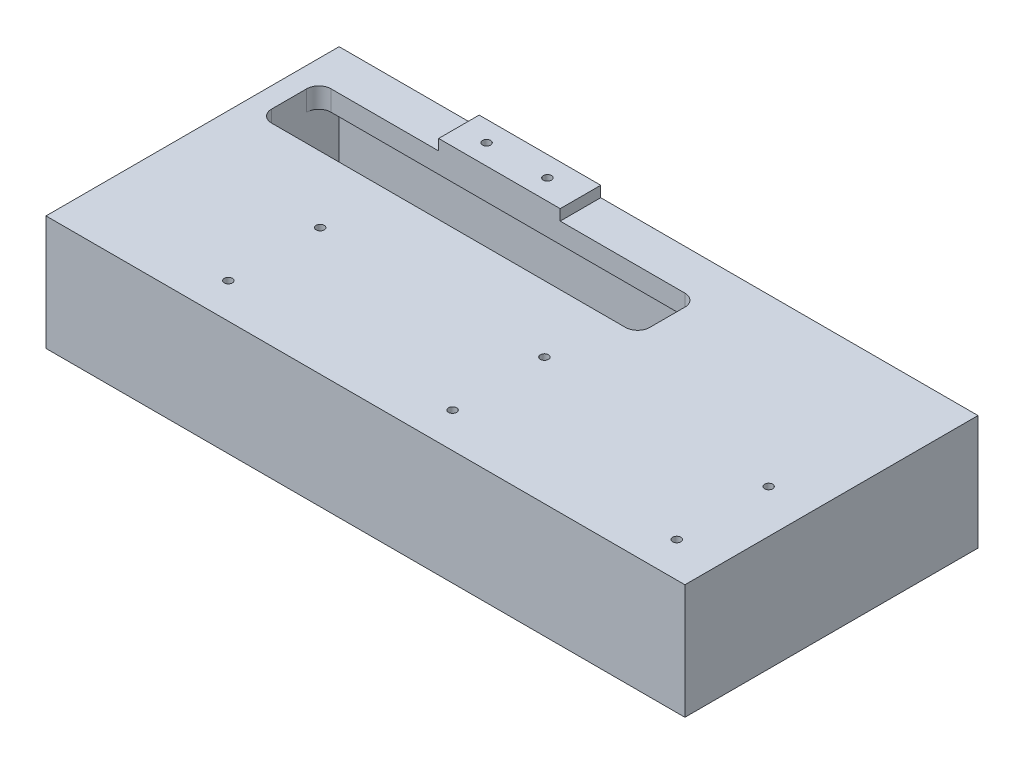
ISO-10303-21;
HEADER;
FILE_DESCRIPTION(('STEP AP214'),'2;1');
FILE_NAME('part.step','',(''),(''),'','','');
FILE_SCHEMA(('AUTOMOTIVE_DESIGN { 1 0 10303 214 1 1 1 1 }'));
ENDSEC;
DATA;
#1=APPLICATION_CONTEXT('core data for automotive mechanical design processes');
#2=APPLICATION_PROTOCOL_DEFINITION('international standard','automotive_design',2000,#1);
#3=PRODUCT_CONTEXT('',#1,'mechanical');
#4=PRODUCT('Part','Part','',(#3));
#5=PRODUCT_RELATED_PRODUCT_CATEGORY('part','',(#4));
#6=PRODUCT_DEFINITION_FORMATION('','',#4);
#7=PRODUCT_DEFINITION_CONTEXT('part definition',#1,'design');
#8=PRODUCT_DEFINITION('design','',#6,#7);
#9=PRODUCT_DEFINITION_SHAPE('','',#8);
#10=(LENGTH_UNIT() NAMED_UNIT(*) SI_UNIT(.MILLI.,.METRE.));
#11=(NAMED_UNIT(*) PLANE_ANGLE_UNIT() SI_UNIT($,.RADIAN.));
#12=(NAMED_UNIT(*) SI_UNIT($,.STERADIAN.) SOLID_ANGLE_UNIT());
#13=UNCERTAINTY_MEASURE_WITH_UNIT(LENGTH_MEASURE(1.E-05),#10,'distance_accuracy_value','');
#14=(GEOMETRIC_REPRESENTATION_CONTEXT(3) GLOBAL_UNCERTAINTY_ASSIGNED_CONTEXT((#13)) GLOBAL_UNIT_ASSIGNED_CONTEXT((#10,
#11,#12)) REPRESENTATION_CONTEXT('',''));
#15=CARTESIAN_POINT('',(0.,0.,0.));
#16=DIRECTION('',(0.,0.,1.));
#17=DIRECTION('',(1.,0.,0.));
#18=AXIS2_PLACEMENT_3D('',#15,#16,#17);
#19=CARTESIAN_POINT('',(-236.5,85.,108.5));
#20=DIRECTION('',(1.,0.,0.));
#21=DIRECTION('',(0.,0.,-1.));
#22=AXIS2_PLACEMENT_3D('',#19,#20,#21);
#23=PLANE('',#22);
#24=DIRECTION('',(0.,0.,1.));
#25=VECTOR('',#24,1.);
#26=CARTESIAN_POINT('',(-236.5,0.,108.5));
#27=LINE('',#26,#25);
#28=CARTESIAN_POINT('',(-236.5,0.,-108.5));
#29=VERTEX_POINT('',#28);
#30=CARTESIAN_POINT('',(-236.5,0.,108.5));
#31=VERTEX_POINT('',#30);
#32=EDGE_CURVE('E244',#29,#31,#27,.T.);
#33=ORIENTED_EDGE('',*,*,#32,.T.);
#34=DIRECTION('',(0.,-1.,0.));
#35=VECTOR('',#34,1.);
#36=CARTESIAN_POINT('',(-236.5,85.,108.5));
#37=LINE('',#36,#35);
#38=CARTESIAN_POINT('',(-236.5,85.,108.5));
#39=VERTEX_POINT('',#38);
#40=EDGE_CURVE('E281',#39,#31,#37,.T.);
#41=ORIENTED_EDGE('',*,*,#40,.F.);
#42=DIRECTION('',(0.,0.,1.));
#43=VECTOR('',#42,1.);
#44=CARTESIAN_POINT('',(-236.5,85.,108.5));
#45=LINE('',#44,#43);
#46=CARTESIAN_POINT('',(-236.5,85.,-108.5));
#47=VERTEX_POINT('',#46);
#48=EDGE_CURVE('E254',#47,#39,#45,.T.);
#49=ORIENTED_EDGE('',*,*,#48,.F.);
#50=DIRECTION('',(0.,-1.,0.));
#51=VECTOR('',#50,1.);
#52=CARTESIAN_POINT('',(-236.5,85.,-108.5));
#53=LINE('',#52,#51);
#54=EDGE_CURVE('E265',#47,#29,#53,.T.);
#55=ORIENTED_EDGE('',*,*,#54,.T.);
#56=EDGE_LOOP('',(#33,#41,#49,#55));
#57=FACE_BOUND('',#56,.T.);
#58=ADVANCED_FACE('F37',(#57),#23,.F.);
#59=CARTESIAN_POINT('',(236.5,85.,108.5));
#60=DIRECTION('',(0.,0.,-1.));
#61=DIRECTION('',(-1.,0.,0.));
#62=AXIS2_PLACEMENT_3D('',#59,#60,#61);
#63=PLANE('',#62);
#64=DIRECTION('',(1.,0.,0.));
#65=VECTOR('',#64,1.);
#66=CARTESIAN_POINT('',(236.5,0.,108.5));
#67=LINE('',#66,#65);
#68=CARTESIAN_POINT('',(236.5,0.,108.5));
#69=VERTEX_POINT('',#68);
#70=EDGE_CURVE('E268',#31,#69,#67,.T.);
#71=ORIENTED_EDGE('',*,*,#70,.T.);
#72=DIRECTION('',(0.,-1.,0.));
#73=VECTOR('',#72,1.);
#74=CARTESIAN_POINT('',(236.5,85.,108.5));
#75=LINE('',#74,#73);
#76=CARTESIAN_POINT('',(236.5,85.,108.5));
#77=VERTEX_POINT('',#76);
#78=EDGE_CURVE('E278',#77,#69,#75,.T.);
#79=ORIENTED_EDGE('',*,*,#78,.F.);
#80=DIRECTION('',(1.,0.,0.));
#81=VECTOR('',#80,1.);
#82=CARTESIAN_POINT('',(236.5,85.,108.5));
#83=LINE('',#82,#81);
#84=EDGE_CURVE('E257',#39,#77,#83,.T.);
#85=ORIENTED_EDGE('',*,*,#84,.F.);
#86=ORIENTED_EDGE('',*,*,#40,.T.);
#87=EDGE_LOOP('',(#71,#79,#85,#86));
#88=FACE_BOUND('',#87,.T.);
#89=ADVANCED_FACE('F423',(#88),#63,.F.);
#90=CARTESIAN_POINT('',(236.5,85.,108.5));
#91=DIRECTION('',(-1.,0.,0.));
#92=DIRECTION('',(0.,0.,1.));
#93=AXIS2_PLACEMENT_3D('',#90,#91,#92);
#94=PLANE('',#93);
#95=DIRECTION('',(0.,0.,-1.));
#96=VECTOR('',#95,1.);
#97=CARTESIAN_POINT('',(236.5,0.,108.5));
#98=LINE('',#97,#96);
#99=CARTESIAN_POINT('',(236.5,0.,-108.5));
#100=VERTEX_POINT('',#99);
#101=EDGE_CURVE('E270',#69,#100,#98,.T.);
#102=ORIENTED_EDGE('',*,*,#101,.T.);
#103=DIRECTION('',(0.,-1.,0.));
#104=VECTOR('',#103,1.);
#105=CARTESIAN_POINT('',(236.5,85.,-108.5));
#106=LINE('',#105,#104);
#107=CARTESIAN_POINT('',(236.5,85.,-108.5));
#108=VERTEX_POINT('',#107);
#109=EDGE_CURVE('E275',#108,#100,#106,.T.);
#110=ORIENTED_EDGE('',*,*,#109,.F.);
#111=DIRECTION('',(0.,0.,-1.));
#112=VECTOR('',#111,1.);
#113=CARTESIAN_POINT('',(236.5,85.,108.5));
#114=LINE('',#113,#112);
#115=EDGE_CURVE('E260',#77,#108,#114,.T.);
#116=ORIENTED_EDGE('',*,*,#115,.F.);
#117=ORIENTED_EDGE('',*,*,#78,.T.);
#118=EDGE_LOOP('',(#102,#110,#116,#117));
#119=FACE_BOUND('',#118,.T.);
#120=ADVANCED_FACE('F429',(#119),#94,.F.);
#121=CARTESIAN_POINT('',(236.5,85.,-108.5));
#122=DIRECTION('',(0.,0.,1.));
#123=DIRECTION('',(1.,0.,0.));
#124=AXIS2_PLACEMENT_3D('',#121,#122,#123);
#125=PLANE('',#124);
#126=DIRECTION('',(-1.,0.,0.));
#127=VECTOR('',#126,1.);
#128=CARTESIAN_POINT('',(236.5,0.,-108.5));
#129=LINE('',#128,#127);
#130=EDGE_CURVE('E258',#100,#29,#129,.T.);
#131=ORIENTED_EDGE('',*,*,#130,.T.);
#132=ORIENTED_EDGE('',*,*,#54,.F.);
#133=DIRECTION('',(-1.,0.,0.));
#134=VECTOR('',#133,1.);
#135=CARTESIAN_POINT('',(236.5,85.,-108.5));
#136=LINE('',#135,#134);
#137=CARTESIAN_POINT('',(-132.81,85.,-108.5));
#138=VERTEX_POINT('',#137);
#139=EDGE_CURVE('E262',#138,#47,#136,.T.);
#140=ORIENTED_EDGE('',*,*,#139,.F.);
#141=DIRECTION('',(0.,-1.,0.));
#142=VECTOR('',#141,1.);
#143=CARTESIAN_POINT('',(-132.81,93.,-108.5));
#144=LINE('',#143,#142);
#145=CARTESIAN_POINT('',(-132.81,93.,-108.5));
#146=VERTEX_POINT('',#145);
#147=EDGE_CURVE('E342',#146,#138,#144,.T.);
#148=ORIENTED_EDGE('',*,*,#147,.F.);
#149=DIRECTION('',(-1.,0.,0.));
#150=VECTOR('',#149,1.);
#151=CARTESIAN_POINT('',(-132.81,93.,-108.5));
#152=LINE('',#151,#150);
#153=CARTESIAN_POINT('',(-42.81,93.,-108.5));
#154=VERTEX_POINT('',#153);
#155=EDGE_CURVE('E189',#154,#146,#152,.T.);
#156=ORIENTED_EDGE('',*,*,#155,.F.);
#157=DIRECTION('',(0.,-1.,0.));
#158=VECTOR('',#157,1.);
#159=CARTESIAN_POINT('',(-42.81,93.,-108.5));
#160=LINE('',#159,#158);
#161=CARTESIAN_POINT('',(-42.81,85.,-108.5));
#162=VERTEX_POINT('',#161);
#163=EDGE_CURVE('E200',#154,#162,#160,.T.);
#164=ORIENTED_EDGE('',*,*,#163,.T.);
#165=EDGE_CURVE('E263',#108,#162,#136,.T.);
#166=ORIENTED_EDGE('',*,*,#165,.F.);
#167=ORIENTED_EDGE('',*,*,#109,.T.);
#168=EDGE_LOOP('',(#131,#132,#140,#148,#156,#164,#166,#167));
#169=FACE_BOUND('',#168,.T.);
#170=ADVANCED_FACE('F344',(#169),#125,.F.);
#171=CARTESIAN_POINT('',(0.,85.,0.));
#172=DIRECTION('',(0.,1.,0.));
#173=DIRECTION('',(0.,0.,1.));
#174=AXIS2_PLACEMENT_3D('',#171,#172,#173);
#175=PLANE('',#174);
#176=CARTESIAN_POINT('',(-127.5,85.,14.5));
#177=DIRECTION('',(0.,1.,0.));
#178=DIRECTION('',(0.,0.,1.));
#179=AXIS2_PLACEMENT_3D('',#176,#177,#178);
#180=CIRCLE('',#179,2.99999999999999);
#181=CARTESIAN_POINT('',(-127.5,85.,17.5));
#182=VERTEX_POINT('',#181);
#183=EDGE_CURVE('E363',#182,#182,#180,.T.);
#184=ORIENTED_EDGE('',*,*,#183,.F.);
#185=EDGE_LOOP('',(#184));
#186=FACE_BOUND('',#185,.T.);
#187=CARTESIAN_POINT('',(38.5,85.,14.5));
#188=DIRECTION('',(0.,1.,0.));
#189=DIRECTION('',(0.,0.,1.));
#190=AXIS2_PLACEMENT_3D('',#187,#188,#189);
#191=CIRCLE('',#190,3.00000000000001);
#192=CARTESIAN_POINT('',(38.5,85.,17.5));
#193=VERTEX_POINT('',#192);
#194=EDGE_CURVE('E382',#193,#193,#191,.T.);
#195=ORIENTED_EDGE('',*,*,#194,.F.);
#196=EDGE_LOOP('',(#195));
#197=FACE_BOUND('',#196,.T.);
#198=CARTESIAN_POINT('',(204.5,85.,14.5));
#199=DIRECTION('',(0.,1.,0.));
#200=DIRECTION('',(0.,0.,1.));
#201=AXIS2_PLACEMENT_3D('',#198,#199,#200);
#202=CIRCLE('',#201,2.99999999999999);
#203=CARTESIAN_POINT('',(204.5,85.,17.5));
#204=VERTEX_POINT('',#203);
#205=EDGE_CURVE('E376',#204,#204,#202,.T.);
#206=ORIENTED_EDGE('',*,*,#205,.F.);
#207=EDGE_LOOP('',(#206));
#208=FACE_BOUND('',#207,.T.);
#209=CARTESIAN_POINT('',(204.5,85.,82.5));
#210=DIRECTION('',(0.,1.,0.));
#211=DIRECTION('',(0.,0.,1.));
#212=AXIS2_PLACEMENT_3D('',#209,#210,#211);
#213=CIRCLE('',#212,2.99999999999999);
#214=CARTESIAN_POINT('',(204.5,85.,85.5));
#215=VERTEX_POINT('',#214);
#216=EDGE_CURVE('E369',#215,#215,#213,.T.);
#217=ORIENTED_EDGE('',*,*,#216,.F.);
#218=EDGE_LOOP('',(#217));
#219=FACE_BOUND('',#218,.T.);
#220=CARTESIAN_POINT('',(38.5,85.,82.5));
#221=DIRECTION('',(0.,1.,0.));
#222=DIRECTION('',(0.,0.,1.));
#223=AXIS2_PLACEMENT_3D('',#220,#221,#222);
#224=CIRCLE('',#223,3.00000000000001);
#225=CARTESIAN_POINT('',(38.5,85.,85.5));
#226=VERTEX_POINT('',#225);
#227=EDGE_CURVE('E370',#226,#226,#224,.T.);
#228=ORIENTED_EDGE('',*,*,#227,.F.);
#229=EDGE_LOOP('',(#228));
#230=FACE_BOUND('',#229,.T.);
#231=CARTESIAN_POINT('',(-127.5,85.,82.5));
#232=DIRECTION('',(0.,1.,0.));
#233=DIRECTION('',(0.,0.,1.));
#234=AXIS2_PLACEMENT_3D('',#231,#232,#233);
#235=CIRCLE('',#234,2.99999999999999);
#236=CARTESIAN_POINT('',(-127.5,85.,85.5));
#237=VERTEX_POINT('',#236);
#238=EDGE_CURVE('E360',#237,#237,#235,.T.);
#239=ORIENTED_EDGE('',*,*,#238,.F.);
#240=EDGE_LOOP('',(#239));
#241=FACE_BOUND('',#240,.T.);
#242=DIRECTION('',(0.,0.,1.));
#243=VECTOR('',#242,1.);
#244=CARTESIAN_POINT('',(-132.81,85.,-108.5));
#245=LINE('',#244,#243);
#246=CARTESIAN_POINT('',(-132.81,85.,-78.5));
#247=VERTEX_POINT('',#246);
#248=EDGE_CURVE('E52',#138,#247,#245,.T.);
#249=ORIENTED_EDGE('',*,*,#248,.F.);
#250=ORIENTED_EDGE('',*,*,#139,.T.);
#251=ORIENTED_EDGE('',*,*,#48,.T.);
#252=ORIENTED_EDGE('',*,*,#84,.T.);
#253=ORIENTED_EDGE('',*,*,#115,.T.);
#254=ORIENTED_EDGE('',*,*,#165,.T.);
#255=DIRECTION('',(0.,0.,-1.));
#256=VECTOR('',#255,1.);
#257=CARTESIAN_POINT('',(-42.81,85.,-108.5));
#258=LINE('',#257,#256);
#259=CARTESIAN_POINT('',(-42.81,85.,-78.4999999999999));
#260=VERTEX_POINT('',#259);
#261=EDGE_CURVE('E193',#260,#162,#258,.T.);
#262=ORIENTED_EDGE('',*,*,#261,.F.);
#263=DIRECTION('',(-1.,0.,0.));
#264=VECTOR('',#263,1.);
#265=CARTESIAN_POINT('',(-221.5,85.,-78.5));
#266=LINE('',#265,#264);
#267=CARTESIAN_POINT('',(49.5,85.,-78.4999999999999));
#268=VERTEX_POINT('',#267);
#269=EDGE_CURVE('E238',#268,#260,#266,.T.);
#270=ORIENTED_EDGE('',*,*,#269,.F.);
#271=CARTESIAN_POINT('',(49.5,85.,-69.5));
#272=DIRECTION('',(0.,1.,0.));
#273=DIRECTION('',(0.,0.,1.));
#274=AXIS2_PLACEMENT_3D('',#271,#272,#273);
#275=CIRCLE('',#274,9.);
#276=CARTESIAN_POINT('',(58.5,85.,-69.5));
#277=VERTEX_POINT('',#276);
#278=EDGE_CURVE('E313',#268,#277,#275,.F.);
#279=ORIENTED_EDGE('',*,*,#278,.T.);
#280=DIRECTION('',(0.,0.,-1.));
#281=VECTOR('',#280,1.);
#282=CARTESIAN_POINT('',(58.5,85.,-78.4999999999999));
#283=LINE('',#282,#281);
#284=CARTESIAN_POINT('',(58.5,85.,-43.5));
#285=VERTEX_POINT('',#284);
#286=EDGE_CURVE('E250',#285,#277,#283,.T.);
#287=ORIENTED_EDGE('',*,*,#286,.F.);
#288=CARTESIAN_POINT('',(49.5,85.,-43.5));
#289=DIRECTION('',(0.,1.,0.));
#290=DIRECTION('',(0.,0.,1.));
#291=AXIS2_PLACEMENT_3D('',#288,#289,#290);
#292=CIRCLE('',#291,9.);
#293=CARTESIAN_POINT('',(49.5,85.,-34.5));
#294=VERTEX_POINT('',#293);
#295=EDGE_CURVE('E309',#285,#294,#292,.F.);
#296=ORIENTED_EDGE('',*,*,#295,.T.);
#297=DIRECTION('',(1.,0.,0.));
#298=VECTOR('',#297,1.);
#299=CARTESIAN_POINT('',(-221.5,85.,-34.5));
#300=LINE('',#299,#298);
#301=CARTESIAN_POINT('',(-212.5,85.,-34.5));
#302=VERTEX_POINT('',#301);
#303=EDGE_CURVE('E247',#302,#294,#300,.T.);
#304=ORIENTED_EDGE('',*,*,#303,.F.);
#305=CARTESIAN_POINT('',(-212.5,85.,-43.5));
#306=DIRECTION('',(0.,1.,0.));
#307=DIRECTION('',(0.,0.,1.));
#308=AXIS2_PLACEMENT_3D('',#305,#306,#307);
#309=CIRCLE('',#308,9.);
#310=CARTESIAN_POINT('',(-221.5,85.,-43.5));
#311=VERTEX_POINT('',#310);
#312=EDGE_CURVE('E305',#302,#311,#309,.F.);
#313=ORIENTED_EDGE('',*,*,#312,.T.);
#314=DIRECTION('',(0.,0.,1.));
#315=VECTOR('',#314,1.);
#316=CARTESIAN_POINT('',(-221.5,85.,-78.5));
#317=LINE('',#316,#315);
#318=CARTESIAN_POINT('',(-221.5,85.,-69.5));
#319=VERTEX_POINT('',#318);
#320=EDGE_CURVE('E227',#319,#311,#317,.T.);
#321=ORIENTED_EDGE('',*,*,#320,.F.);
#322=CARTESIAN_POINT('',(-212.5,85.,-69.5));
#323=DIRECTION('',(0.,1.,0.));
#324=DIRECTION('',(0.,0.,1.));
#325=AXIS2_PLACEMENT_3D('',#322,#323,#324);
#326=CIRCLE('',#325,9.);
#327=CARTESIAN_POINT('',(-212.5,85.,-78.5));
#328=VERTEX_POINT('',#327);
#329=EDGE_CURVE('E45',#319,#328,#326,.F.);
#330=ORIENTED_EDGE('',*,*,#329,.T.);
#331=EDGE_CURVE('E57',#247,#328,#266,.T.);
#332=ORIENTED_EDGE('',*,*,#331,.F.);
#333=EDGE_LOOP('',(#249,#250,#251,#252,#253,#254,#262,#270,#279,#287,#296,#304,#313,#321,#330,#332));
#334=FACE_BOUND('',#333,.T.);
#335=ADVANCED_FACE('F318',(#186,#197,#208,#219,#230,#241,#334),#175,.T.);
#336=CARTESIAN_POINT('',(0.,0.,0.));
#337=DIRECTION('',(0.,1.,0.));
#338=DIRECTION('',(0.,0.,1.));
#339=AXIS2_PLACEMENT_3D('',#336,#337,#338);
#340=PLANE('',#339);
#341=DIRECTION('',(0.,0.,-1.));
#342=VECTOR('',#341,1.);
#343=CARTESIAN_POINT('',(-221.5,0.,93.5));
#344=LINE('',#343,#342);
#345=CARTESIAN_POINT('',(-221.5,0.,93.5));
#346=VERTEX_POINT('',#345);
#347=CARTESIAN_POINT('',(-221.5,0.,-93.5));
#348=VERTEX_POINT('',#347);
#349=EDGE_CURVE('E198',#346,#348,#344,.T.);
#350=ORIENTED_EDGE('',*,*,#349,.F.);
#351=DIRECTION('',(-1.,0.,0.));
#352=VECTOR('',#351,1.);
#353=CARTESIAN_POINT('',(221.5,0.,93.5));
#354=LINE('',#353,#352);
#355=CARTESIAN_POINT('',(221.5,0.,93.5));
#356=VERTEX_POINT('',#355);
#357=EDGE_CURVE('E196',#356,#346,#354,.T.);
#358=ORIENTED_EDGE('',*,*,#357,.F.);
#359=DIRECTION('',(0.,0.,1.));
#360=VECTOR('',#359,1.);
#361=CARTESIAN_POINT('',(221.5,0.,-93.5));
#362=LINE('',#361,#360);
#363=CARTESIAN_POINT('',(221.5,0.,-93.5));
#364=VERTEX_POINT('',#363);
#365=EDGE_CURVE('E208',#364,#356,#362,.T.);
#366=ORIENTED_EDGE('',*,*,#365,.F.);
#367=DIRECTION('',(1.,0.,0.));
#368=VECTOR('',#367,1.);
#369=CARTESIAN_POINT('',(-221.5,0.,-93.5));
#370=LINE('',#369,#368);
#371=EDGE_CURVE('E220',#348,#364,#370,.T.);
#372=ORIENTED_EDGE('',*,*,#371,.F.);
#373=EDGE_LOOP('',(#350,#358,#366,#372));
#374=FACE_BOUND('',#373,.T.);
#375=ORIENTED_EDGE('',*,*,#32,.F.);
#376=ORIENTED_EDGE('',*,*,#130,.F.);
#377=ORIENTED_EDGE('',*,*,#101,.F.);
#378=ORIENTED_EDGE('',*,*,#70,.F.);
#379=EDGE_LOOP('',(#375,#376,#377,#378));
#380=FACE_BOUND('',#379,.T.);
#381=ADVANCED_FACE('F400',(#374,#380),#340,.F.);
#382=CARTESIAN_POINT('',(-221.5,70.,-78.5));
#383=DIRECTION('',(-1.,0.,0.));
#384=DIRECTION('',(0.,0.,1.));
#385=AXIS2_PLACEMENT_3D('',#382,#383,#384);
#386=PLANE('',#385);
#387=ORIENTED_EDGE('',*,*,#320,.T.);
#388=DIRECTION('',(0.,1.,0.));
#389=VECTOR('',#388,1.);
#390=CARTESIAN_POINT('',(-221.5,70.,-43.5));
#391=LINE('',#390,#389);
#392=CARTESIAN_POINT('',(-221.5,70.,-43.5));
#393=VERTEX_POINT('',#392);
#394=EDGE_CURVE('E292',#311,#393,#391,.F.);
#395=ORIENTED_EDGE('',*,*,#394,.T.);
#396=DIRECTION('',(0.,0.,-1.));
#397=VECTOR('',#396,1.);
#398=CARTESIAN_POINT('',(-221.5,70.,93.5));
#399=LINE('',#398,#397);
#400=CARTESIAN_POINT('',(-221.5,70.,93.5));
#401=VERTEX_POINT('',#400);
#402=EDGE_CURVE('E209',#401,#393,#399,.T.);
#403=ORIENTED_EDGE('',*,*,#402,.F.);
#404=DIRECTION('',(0.,-1.,0.));
#405=VECTOR('',#404,1.);
#406=CARTESIAN_POINT('',(-221.5,70.,93.5));
#407=LINE('',#406,#405);
#408=EDGE_CURVE('E216',#401,#346,#407,.T.);
#409=ORIENTED_EDGE('',*,*,#408,.T.);
#410=ORIENTED_EDGE('',*,*,#349,.T.);
#411=DIRECTION('',(0.,-1.,0.));
#412=VECTOR('',#411,1.);
#413=CARTESIAN_POINT('',(-221.5,70.,-93.5));
#414=LINE('',#413,#412);
#415=CARTESIAN_POINT('',(-221.5,70.,-93.5));
#416=VERTEX_POINT('',#415);
#417=EDGE_CURVE('E230',#416,#348,#414,.T.);
#418=ORIENTED_EDGE('',*,*,#417,.F.);
#419=CARTESIAN_POINT('',(-221.5,70.,-69.5));
#420=VERTEX_POINT('',#419);
#421=EDGE_CURVE('E207',#420,#416,#399,.T.);
#422=ORIENTED_EDGE('',*,*,#421,.F.);
#423=DIRECTION('',(0.,1.,0.));
#424=VECTOR('',#423,1.);
#425=CARTESIAN_POINT('',(-221.5,85.,-69.5));
#426=LINE('',#425,#424);
#427=EDGE_CURVE('E289',#420,#319,#426,.T.);
#428=ORIENTED_EDGE('',*,*,#427,.T.);
#429=EDGE_LOOP('',(#387,#395,#403,#409,#410,#418,#422,#428));
#430=FACE_BOUND('',#429,.T.);
#431=ADVANCED_FACE('F474',(#430),#386,.F.);
#432=CARTESIAN_POINT('',(-221.5,70.,-78.5));
#433=DIRECTION('',(0.,0.,-1.));
#434=DIRECTION('',(-1.,0.,0.));
#435=AXIS2_PLACEMENT_3D('',#432,#433,#434);
#436=PLANE('',#435);
#437=DIRECTION('',(-1.,0.,0.));
#438=VECTOR('',#437,1.);
#439=CARTESIAN_POINT('',(-221.5,70.,-78.5));
#440=LINE('',#439,#438);
#441=CARTESIAN_POINT('',(49.5,70.,-78.4999999999999));
#442=VERTEX_POINT('',#441);
#443=CARTESIAN_POINT('',(-212.5,70.,-78.5));
#444=VERTEX_POINT('',#443);
#445=EDGE_CURVE('E241',#442,#444,#440,.T.);
#446=ORIENTED_EDGE('',*,*,#445,.F.);
#447=DIRECTION('',(0.,1.,0.));
#448=VECTOR('',#447,1.);
#449=CARTESIAN_POINT('',(49.5,85.,-78.4999999999999));
#450=LINE('',#449,#448);
#451=EDGE_CURVE('E302',#442,#268,#450,.T.);
#452=ORIENTED_EDGE('',*,*,#451,.T.);
#453=ORIENTED_EDGE('',*,*,#269,.T.);
#454=DIRECTION('',(0.,-1.,0.));
#455=VECTOR('',#454,1.);
#456=CARTESIAN_POINT('',(-42.81,93.,-78.4999999999999));
#457=LINE('',#456,#455);
#458=CARTESIAN_POINT('',(-42.81,93.,-78.4999999999999));
#459=VERTEX_POINT('',#458);
#460=EDGE_CURVE('E180',#459,#260,#457,.T.);
#461=ORIENTED_EDGE('',*,*,#460,.F.);
#462=DIRECTION('',(1.,0.,0.));
#463=VECTOR('',#462,1.);
#464=CARTESIAN_POINT('',(-132.81,93.,-78.4999999999999));
#465=LINE('',#464,#463);
#466=CARTESIAN_POINT('',(-132.81,93.,-78.4999999999999));
#467=VERTEX_POINT('',#466);
#468=EDGE_CURVE('E172',#467,#459,#465,.T.);
#469=ORIENTED_EDGE('',*,*,#468,.F.);
#470=DIRECTION('',(0.,-1.,0.));
#471=VECTOR('',#470,1.);
#472=CARTESIAN_POINT('',(-132.81,93.,-78.4999999999999));
#473=LINE('',#472,#471);
#474=EDGE_CURVE('E177',#467,#247,#473,.T.);
#475=ORIENTED_EDGE('',*,*,#474,.T.);
#476=ORIENTED_EDGE('',*,*,#331,.T.);
#477=DIRECTION('',(0.,1.,0.));
#478=VECTOR('',#477,1.);
#479=CARTESIAN_POINT('',(-212.5,70.,-78.5));
#480=LINE('',#479,#478);
#481=EDGE_CURVE('E300',#328,#444,#480,.F.);
#482=ORIENTED_EDGE('',*,*,#481,.T.);
#483=EDGE_LOOP('',(#446,#452,#453,#461,#469,#475,#476,#482));
#484=FACE_BOUND('',#483,.T.);
#485=ADVANCED_FACE('F175',(#484),#436,.F.);
#486=CARTESIAN_POINT('',(58.5,70.,-78.4999999999999));
#487=DIRECTION('',(1.,0.,0.));
#488=DIRECTION('',(0.,0.,-1.));
#489=AXIS2_PLACEMENT_3D('',#486,#487,#488);
#490=PLANE('',#489);
#491=DIRECTION('',(0.,0.,-1.));
#492=VECTOR('',#491,1.);
#493=CARTESIAN_POINT('',(58.5,70.,-78.4999999999999));
#494=LINE('',#493,#492);
#495=CARTESIAN_POINT('',(58.5,70.,-43.5));
#496=VERTEX_POINT('',#495);
#497=CARTESIAN_POINT('',(58.5,70.,-69.5));
#498=VERTEX_POINT('',#497);
#499=EDGE_CURVE('E237',#496,#498,#494,.T.);
#500=ORIENTED_EDGE('',*,*,#499,.F.);
#501=DIRECTION('',(0.,1.,0.));
#502=VECTOR('',#501,1.);
#503=CARTESIAN_POINT('',(58.5,85.,-43.5));
#504=LINE('',#503,#502);
#505=EDGE_CURVE('E297',#496,#285,#504,.T.);
#506=ORIENTED_EDGE('',*,*,#505,.T.);
#507=ORIENTED_EDGE('',*,*,#286,.T.);
#508=DIRECTION('',(0.,1.,0.));
#509=VECTOR('',#508,1.);
#510=CARTESIAN_POINT('',(58.5,70.,-69.5));
#511=LINE('',#510,#509);
#512=EDGE_CURVE('E295',#277,#498,#511,.F.);
#513=ORIENTED_EDGE('',*,*,#512,.T.);
#514=EDGE_LOOP('',(#500,#506,#507,#513));
#515=FACE_BOUND('',#514,.T.);
#516=ADVANCED_FACE('F473',(#515),#490,.F.);
#517=CARTESIAN_POINT('',(-221.5,70.,-34.5));
#518=DIRECTION('',(0.,0.,1.));
#519=DIRECTION('',(1.,0.,0.));
#520=AXIS2_PLACEMENT_3D('',#517,#518,#519);
#521=PLANE('',#520);
#522=DIRECTION('',(1.,0.,0.));
#523=VECTOR('',#522,1.);
#524=CARTESIAN_POINT('',(-221.5,70.,-34.5));
#525=LINE('',#524,#523);
#526=CARTESIAN_POINT('',(-212.5,70.,-34.5));
#527=VERTEX_POINT('',#526);
#528=CARTESIAN_POINT('',(49.5,70.,-34.5));
#529=VERTEX_POINT('',#528);
#530=EDGE_CURVE('E234',#527,#529,#525,.T.);
#531=ORIENTED_EDGE('',*,*,#530,.F.);
#532=DIRECTION('',(0.,1.,0.));
#533=VECTOR('',#532,1.);
#534=CARTESIAN_POINT('',(-212.5,85.,-34.5));
#535=LINE('',#534,#533);
#536=EDGE_CURVE('E286',#527,#302,#535,.T.);
#537=ORIENTED_EDGE('',*,*,#536,.T.);
#538=ORIENTED_EDGE('',*,*,#303,.T.);
#539=DIRECTION('',(0.,1.,0.));
#540=VECTOR('',#539,1.);
#541=CARTESIAN_POINT('',(49.5,70.,-34.5));
#542=LINE('',#541,#540);
#543=EDGE_CURVE('E284',#294,#529,#542,.F.);
#544=ORIENTED_EDGE('',*,*,#543,.T.);
#545=EDGE_LOOP('',(#531,#537,#538,#544));
#546=FACE_BOUND('',#545,.T.);
#547=ADVANCED_FACE('F459',(#546),#521,.F.);
#548=CARTESIAN_POINT('',(0.,70.,0.));
#549=DIRECTION('',(0.,-1.,0.));
#550=DIRECTION('',(0.,0.,-1.));
#551=AXIS2_PLACEMENT_3D('',#548,#549,#550);
#552=PLANE('',#551);
#553=CARTESIAN_POINT('',(-127.5,70.,14.5));
#554=DIRECTION('',(0.,1.,0.));
#555=DIRECTION('',(0.,0.,1.));
#556=AXIS2_PLACEMENT_3D('',#553,#554,#555);
#557=CIRCLE('',#556,2.99999999999999);
#558=CARTESIAN_POINT('',(-127.5,70.,17.5));
#559=VERTEX_POINT('',#558);
#560=EDGE_CURVE('E385',#559,#559,#557,.T.);
#561=ORIENTED_EDGE('',*,*,#560,.T.);
#562=EDGE_LOOP('',(#561));
#563=FACE_BOUND('',#562,.T.);
#564=CARTESIAN_POINT('',(38.5,70.,14.5));
#565=DIRECTION('',(0.,1.,0.));
#566=DIRECTION('',(0.,0.,1.));
#567=AXIS2_PLACEMENT_3D('',#564,#565,#566);
#568=CIRCLE('',#567,3.00000000000001);
#569=CARTESIAN_POINT('',(38.5,70.,17.5));
#570=VERTEX_POINT('',#569);
#571=EDGE_CURVE('E379',#570,#570,#568,.T.);
#572=ORIENTED_EDGE('',*,*,#571,.T.);
#573=EDGE_LOOP('',(#572));
#574=FACE_BOUND('',#573,.T.);
#575=CARTESIAN_POINT('',(204.5,70.,14.5));
#576=DIRECTION('',(0.,1.,0.));
#577=DIRECTION('',(0.,0.,1.));
#578=AXIS2_PLACEMENT_3D('',#575,#576,#577);
#579=CIRCLE('',#578,2.99999999999999);
#580=CARTESIAN_POINT('',(204.5,70.,17.5));
#581=VERTEX_POINT('',#580);
#582=EDGE_CURVE('E373',#581,#581,#579,.T.);
#583=ORIENTED_EDGE('',*,*,#582,.T.);
#584=EDGE_LOOP('',(#583));
#585=FACE_BOUND('',#584,.T.);
#586=CARTESIAN_POINT('',(204.5,70.,82.5));
#587=DIRECTION('',(0.,1.,0.));
#588=DIRECTION('',(0.,0.,1.));
#589=AXIS2_PLACEMENT_3D('',#586,#587,#588);
#590=CIRCLE('',#589,2.99999999999999);
#591=CARTESIAN_POINT('',(204.5,70.,85.5));
#592=VERTEX_POINT('',#591);
#593=EDGE_CURVE('E366',#592,#592,#590,.T.);
#594=ORIENTED_EDGE('',*,*,#593,.T.);
#595=EDGE_LOOP('',(#594));
#596=FACE_BOUND('',#595,.T.);
#597=CARTESIAN_POINT('',(38.5,70.,82.5));
#598=DIRECTION('',(0.,1.,0.));
#599=DIRECTION('',(0.,0.,1.));
#600=AXIS2_PLACEMENT_3D('',#597,#598,#599);
#601=CIRCLE('',#600,3.00000000000001);
#602=CARTESIAN_POINT('',(38.5,70.,85.5));
#603=VERTEX_POINT('',#602);
#604=EDGE_CURVE('E390',#603,#603,#601,.T.);
#605=ORIENTED_EDGE('',*,*,#604,.T.);
#606=EDGE_LOOP('',(#605));
#607=FACE_BOUND('',#606,.T.);
#608=CARTESIAN_POINT('',(-127.5,70.,82.5));
#609=DIRECTION('',(0.,1.,0.));
#610=DIRECTION('',(0.,0.,1.));
#611=AXIS2_PLACEMENT_3D('',#608,#609,#610);
#612=CIRCLE('',#611,2.99999999999999);
#613=CARTESIAN_POINT('',(-127.5,70.,85.5));
#614=VERTEX_POINT('',#613);
#615=EDGE_CURVE('E352',#614,#614,#612,.T.);
#616=ORIENTED_EDGE('',*,*,#615,.T.);
#617=EDGE_LOOP('',(#616));
#618=FACE_BOUND('',#617,.T.);
#619=ORIENTED_EDGE('',*,*,#402,.T.);
#620=CARTESIAN_POINT('',(-212.5,70.,-43.5));
#621=DIRECTION('',(0.,-1.,0.));
#622=DIRECTION('',(0.,0.,-1.));
#623=AXIS2_PLACEMENT_3D('',#620,#621,#622);
#624=CIRCLE('',#623,9.);
#625=EDGE_CURVE('E307',#393,#527,#624,.F.);
#626=ORIENTED_EDGE('',*,*,#625,.T.);
#627=ORIENTED_EDGE('',*,*,#530,.T.);
#628=CARTESIAN_POINT('',(49.5,70.,-43.5));
#629=DIRECTION('',(0.,-1.,0.));
#630=DIRECTION('',(0.,0.,-1.));
#631=AXIS2_PLACEMENT_3D('',#628,#629,#630);
#632=CIRCLE('',#631,9.);
#633=EDGE_CURVE('E311',#529,#496,#632,.F.);
#634=ORIENTED_EDGE('',*,*,#633,.T.);
#635=ORIENTED_EDGE('',*,*,#499,.T.);
#636=CARTESIAN_POINT('',(49.5,70.,-69.5));
#637=DIRECTION('',(0.,-1.,0.));
#638=DIRECTION('',(0.,0.,-1.));
#639=AXIS2_PLACEMENT_3D('',#636,#637,#638);
#640=CIRCLE('',#639,9.);
#641=EDGE_CURVE('E315',#498,#442,#640,.F.);
#642=ORIENTED_EDGE('',*,*,#641,.T.);
#643=ORIENTED_EDGE('',*,*,#445,.T.);
#644=CARTESIAN_POINT('',(-212.5,70.,-69.5));
#645=DIRECTION('',(0.,-1.,0.));
#646=DIRECTION('',(0.,0.,-1.));
#647=AXIS2_PLACEMENT_3D('',#644,#645,#646);
#648=CIRCLE('',#647,9.);
#649=EDGE_CURVE('E11',#444,#420,#648,.F.);
#650=ORIENTED_EDGE('',*,*,#649,.T.);
#651=ORIENTED_EDGE('',*,*,#421,.T.);
#652=DIRECTION('',(1.,0.,0.));
#653=VECTOR('',#652,1.);
#654=CARTESIAN_POINT('',(-221.5,70.,-93.5));
#655=LINE('',#654,#653);
#656=CARTESIAN_POINT('',(221.5,70.,-93.5));
#657=VERTEX_POINT('',#656);
#658=EDGE_CURVE('E211',#416,#657,#655,.T.);
#659=ORIENTED_EDGE('',*,*,#658,.T.);
#660=DIRECTION('',(0.,0.,1.));
#661=VECTOR('',#660,1.);
#662=CARTESIAN_POINT('',(221.5,70.,-93.5));
#663=LINE('',#662,#661);
#664=CARTESIAN_POINT('',(221.5,70.,93.5));
#665=VERTEX_POINT('',#664);
#666=EDGE_CURVE('E214',#657,#665,#663,.T.);
#667=ORIENTED_EDGE('',*,*,#666,.T.);
#668=DIRECTION('',(-1.,0.,0.));
#669=VECTOR('',#668,1.);
#670=CARTESIAN_POINT('',(221.5,70.,93.5));
#671=LINE('',#670,#669);
#672=EDGE_CURVE('E204',#665,#401,#671,.T.);
#673=ORIENTED_EDGE('',*,*,#672,.T.);
#674=EDGE_LOOP('',(#619,#626,#627,#634,#635,#642,#643,#650,#651,#659,#667,#673));
#675=FACE_BOUND('',#674,.T.);
#676=ADVANCED_FACE('F324',(#563,#574,#585,#596,#607,#618,#675),#552,.T.);
#677=CARTESIAN_POINT('',(221.5,70.,93.5));
#678=DIRECTION('',(0.,0.,1.));
#679=DIRECTION('',(1.,0.,0.));
#680=AXIS2_PLACEMENT_3D('',#677,#678,#679);
#681=PLANE('',#680);
#682=ORIENTED_EDGE('',*,*,#357,.T.);
#683=ORIENTED_EDGE('',*,*,#408,.F.);
#684=ORIENTED_EDGE('',*,*,#672,.F.);
#685=DIRECTION('',(0.,-1.,0.));
#686=VECTOR('',#685,1.);
#687=CARTESIAN_POINT('',(221.5,70.,93.5));
#688=LINE('',#687,#686);
#689=EDGE_CURVE('E225',#665,#356,#688,.T.);
#690=ORIENTED_EDGE('',*,*,#689,.T.);
#691=EDGE_LOOP('',(#682,#683,#684,#690));
#692=FACE_BOUND('',#691,.T.);
#693=ADVANCED_FACE('F458',(#692),#681,.F.);
#694=CARTESIAN_POINT('',(221.5,70.,-93.5));
#695=DIRECTION('',(1.,0.,0.));
#696=DIRECTION('',(0.,0.,-1.));
#697=AXIS2_PLACEMENT_3D('',#694,#695,#696);
#698=PLANE('',#697);
#699=ORIENTED_EDGE('',*,*,#365,.T.);
#700=ORIENTED_EDGE('',*,*,#689,.F.);
#701=ORIENTED_EDGE('',*,*,#666,.F.);
#702=DIRECTION('',(0.,-1.,0.));
#703=VECTOR('',#702,1.);
#704=CARTESIAN_POINT('',(221.5,70.,-93.5));
#705=LINE('',#704,#703);
#706=EDGE_CURVE('E228',#657,#364,#705,.T.);
#707=ORIENTED_EDGE('',*,*,#706,.T.);
#708=EDGE_LOOP('',(#699,#700,#701,#707));
#709=FACE_BOUND('',#708,.T.);
#710=ADVANCED_FACE('F461',(#709),#698,.F.);
#711=CARTESIAN_POINT('',(-221.5,70.,-93.5));
#712=DIRECTION('',(0.,0.,-1.));
#713=DIRECTION('',(-1.,0.,0.));
#714=AXIS2_PLACEMENT_3D('',#711,#712,#713);
#715=PLANE('',#714);
#716=ORIENTED_EDGE('',*,*,#371,.T.);
#717=ORIENTED_EDGE('',*,*,#706,.F.);
#718=ORIENTED_EDGE('',*,*,#658,.F.);
#719=ORIENTED_EDGE('',*,*,#417,.T.);
#720=EDGE_LOOP('',(#716,#717,#718,#719));
#721=FACE_BOUND('',#720,.T.);
#722=ADVANCED_FACE('F438',(#721),#715,.F.);
#723=CARTESIAN_POINT('',(-212.5,70.,-43.5));
#724=DIRECTION('',(0.,-1.,0.));
#725=DIRECTION('',(0.,0.,-1.));
#726=AXIS2_PLACEMENT_3D('',#723,#724,#725);
#727=CYLINDRICAL_SURFACE('',#726,9.);
#728=ORIENTED_EDGE('',*,*,#625,.F.);
#729=ORIENTED_EDGE('',*,*,#394,.F.);
#730=ORIENTED_EDGE('',*,*,#312,.F.);
#731=ORIENTED_EDGE('',*,*,#536,.F.);
#732=EDGE_LOOP('',(#728,#729,#730,#731));
#733=FACE_BOUND('',#732,.T.);
#734=ADVANCED_FACE('F434',(#733),#727,.F.);
#735=CARTESIAN_POINT('',(49.5,70.,-43.5));
#736=DIRECTION('',(0.,-1.,0.));
#737=DIRECTION('',(0.,0.,-1.));
#738=AXIS2_PLACEMENT_3D('',#735,#736,#737);
#739=CYLINDRICAL_SURFACE('',#738,9.);
#740=ORIENTED_EDGE('',*,*,#633,.F.);
#741=ORIENTED_EDGE('',*,*,#543,.F.);
#742=ORIENTED_EDGE('',*,*,#295,.F.);
#743=ORIENTED_EDGE('',*,*,#505,.F.);
#744=EDGE_LOOP('',(#740,#741,#742,#743));
#745=FACE_BOUND('',#744,.T.);
#746=ADVANCED_FACE('F437',(#745),#739,.F.);
#747=CARTESIAN_POINT('',(49.5,70.,-69.5));
#748=DIRECTION('',(0.,-1.,0.));
#749=DIRECTION('',(0.,0.,-1.));
#750=AXIS2_PLACEMENT_3D('',#747,#748,#749);
#751=CYLINDRICAL_SURFACE('',#750,9.);
#752=ORIENTED_EDGE('',*,*,#641,.F.);
#753=ORIENTED_EDGE('',*,*,#512,.F.);
#754=ORIENTED_EDGE('',*,*,#278,.F.);
#755=ORIENTED_EDGE('',*,*,#451,.F.);
#756=EDGE_LOOP('',(#752,#753,#754,#755));
#757=FACE_BOUND('',#756,.T.);
#758=ADVANCED_FACE('F329',(#757),#751,.F.);
#759=CARTESIAN_POINT('',(-212.5,70.,-69.5));
#760=DIRECTION('',(0.,-1.,0.));
#761=DIRECTION('',(0.,0.,-1.));
#762=AXIS2_PLACEMENT_3D('',#759,#760,#761);
#763=CYLINDRICAL_SURFACE('',#762,9.);
#764=ORIENTED_EDGE('',*,*,#649,.F.);
#765=ORIENTED_EDGE('',*,*,#481,.F.);
#766=ORIENTED_EDGE('',*,*,#329,.F.);
#767=ORIENTED_EDGE('',*,*,#427,.F.);
#768=EDGE_LOOP('',(#764,#765,#766,#767));
#769=FACE_BOUND('',#768,.T.);
#770=ADVANCED_FACE('F39',(#769),#763,.F.);
#771=CARTESIAN_POINT('',(-132.81,93.,-108.5));
#772=DIRECTION('',(1.,0.,0.));
#773=DIRECTION('',(0.,0.,-1.));
#774=AXIS2_PLACEMENT_3D('',#771,#772,#773);
#775=PLANE('',#774);
#776=ORIENTED_EDGE('',*,*,#248,.T.);
#777=ORIENTED_EDGE('',*,*,#474,.F.);
#778=DIRECTION('',(0.,0.,1.));
#779=VECTOR('',#778,1.);
#780=CARTESIAN_POINT('',(-132.81,93.,-108.5));
#781=LINE('',#780,#779);
#782=EDGE_CURVE('E184',#146,#467,#781,.T.);
#783=ORIENTED_EDGE('',*,*,#782,.F.);
#784=ORIENTED_EDGE('',*,*,#147,.T.);
#785=EDGE_LOOP('',(#776,#777,#783,#784));
#786=FACE_BOUND('',#785,.T.);
#787=ADVANCED_FACE('F195',(#786),#775,.F.);
#788=CARTESIAN_POINT('',(-42.81,93.,-108.5));
#789=DIRECTION('',(-1.,0.,0.));
#790=DIRECTION('',(0.,0.,1.));
#791=AXIS2_PLACEMENT_3D('',#788,#789,#790);
#792=PLANE('',#791);
#793=ORIENTED_EDGE('',*,*,#261,.T.);
#794=ORIENTED_EDGE('',*,*,#163,.F.);
#795=DIRECTION('',(0.,0.,-1.));
#796=VECTOR('',#795,1.);
#797=CARTESIAN_POINT('',(-42.81,93.,-108.5));
#798=LINE('',#797,#796);
#799=EDGE_CURVE('E183',#459,#154,#798,.T.);
#800=ORIENTED_EDGE('',*,*,#799,.F.);
#801=ORIENTED_EDGE('',*,*,#460,.T.);
#802=EDGE_LOOP('',(#793,#794,#800,#801));
#803=FACE_BOUND('',#802,.T.);
#804=ADVANCED_FACE('F345',(#803),#792,.F.);
#805=CARTESIAN_POINT('',(0.,93.,0.));
#806=DIRECTION('',(0.,1.,0.));
#807=DIRECTION('',(0.,0.,1.));
#808=AXIS2_PLACEMENT_3D('',#805,#806,#807);
#809=PLANE('',#808);
#810=CARTESIAN_POINT('',(-112.31,93.,-93.4999999999999));
#811=DIRECTION('',(0.,1.,0.));
#812=DIRECTION('',(0.,0.,1.));
#813=AXIS2_PLACEMENT_3D('',#810,#811,#812);
#814=CIRCLE('',#813,2.99999999999999);
#815=CARTESIAN_POINT('',(-112.31,93.,-90.5));
#816=VERTEX_POINT('',#815);
#817=EDGE_CURVE('E355',#816,#816,#814,.T.);
#818=ORIENTED_EDGE('',*,*,#817,.F.);
#819=EDGE_LOOP('',(#818));
#820=FACE_BOUND('',#819,.T.);
#821=CARTESIAN_POINT('',(-67.31,93.,-93.5));
#822=DIRECTION('',(0.,1.,0.));
#823=DIRECTION('',(0.,0.,1.));
#824=AXIS2_PLACEMENT_3D('',#821,#822,#823);
#825=CIRCLE('',#824,3.00000000000001);
#826=CARTESIAN_POINT('',(-67.31,93.,-90.5));
#827=VERTEX_POINT('',#826);
#828=EDGE_CURVE('E351',#827,#827,#825,.T.);
#829=ORIENTED_EDGE('',*,*,#828,.F.);
#830=EDGE_LOOP('',(#829));
#831=FACE_BOUND('',#830,.T.);
#832=ORIENTED_EDGE('',*,*,#782,.T.);
#833=ORIENTED_EDGE('',*,*,#468,.T.);
#834=ORIENTED_EDGE('',*,*,#799,.T.);
#835=ORIENTED_EDGE('',*,*,#155,.T.);
#836=EDGE_LOOP('',(#832,#833,#834,#835));
#837=FACE_BOUND('',#836,.T.);
#838=ADVANCED_FACE('F187',(#820,#831,#837),#809,.T.);
#839=CARTESIAN_POINT('',(-67.31,78.,-93.5));
#840=DIRECTION('',(0.,1.,0.));
#841=DIRECTION('',(0.,0.,1.));
#842=AXIS2_PLACEMENT_3D('',#839,#840,#841);
#843=CYLINDRICAL_SURFACE('',#842,3.00000000000001);
#844=CARTESIAN_POINT('',(-67.31,78.,-93.5));
#845=DIRECTION('',(0.,1.,0.));
#846=DIRECTION('',(0.,0.,1.));
#847=AXIS2_PLACEMENT_3D('',#844,#845,#846);
#848=CIRCLE('',#847,3.00000000000001);
#849=CARTESIAN_POINT('',(-67.31,78.,-90.5));
#850=VERTEX_POINT('',#849);
#851=EDGE_CURVE('E348',#850,#850,#848,.T.);
#852=ORIENTED_EDGE('',*,*,#851,.F.);
#853=EDGE_LOOP('',(#852));
#854=FACE_BOUND('',#853,.T.);
#855=ORIENTED_EDGE('',*,*,#828,.T.);
#856=EDGE_LOOP('',(#855));
#857=FACE_BOUND('',#856,.T.);
#858=ADVANCED_FACE('F606',(#854,#857),#843,.F.);
#859=CARTESIAN_POINT('',(-67.31,78.,-93.5));
#860=DIRECTION('',(0.,1.,0.));
#861=DIRECTION('',(0.,0.,1.));
#862=AXIS2_PLACEMENT_3D('',#859,#860,#861);
#863=PLANE('',#862);
#864=ORIENTED_EDGE('',*,*,#851,.T.);
#865=EDGE_LOOP('',(#864));
#866=FACE_BOUND('',#865,.T.);
#867=ADVANCED_FACE('F616',(#866),#863,.T.);
#868=CARTESIAN_POINT('',(-112.31,78.,-93.4999999999999));
#869=DIRECTION('',(0.,1.,0.));
#870=DIRECTION('',(0.,0.,1.));
#871=AXIS2_PLACEMENT_3D('',#868,#869,#870);
#872=CYLINDRICAL_SURFACE('',#871,2.99999999999999);
#873=CARTESIAN_POINT('',(-112.31,78.,-93.4999999999999));
#874=DIRECTION('',(0.,1.,0.));
#875=DIRECTION('',(0.,0.,1.));
#876=AXIS2_PLACEMENT_3D('',#873,#874,#875);
#877=CIRCLE('',#876,2.99999999999999);
#878=CARTESIAN_POINT('',(-112.31,78.,-90.5));
#879=VERTEX_POINT('',#878);
#880=EDGE_CURVE('E338',#879,#879,#877,.T.);
#881=ORIENTED_EDGE('',*,*,#880,.F.);
#882=EDGE_LOOP('',(#881));
#883=FACE_BOUND('',#882,.T.);
#884=ORIENTED_EDGE('',*,*,#817,.T.);
#885=EDGE_LOOP('',(#884));
#886=FACE_BOUND('',#885,.T.);
#887=ADVANCED_FACE('F417',(#883,#886),#872,.F.);
#888=CARTESIAN_POINT('',(-112.31,78.,-93.4999999999999));
#889=DIRECTION('',(0.,1.,0.));
#890=DIRECTION('',(0.,0.,1.));
#891=AXIS2_PLACEMENT_3D('',#888,#889,#890);
#892=PLANE('',#891);
#893=ORIENTED_EDGE('',*,*,#880,.T.);
#894=EDGE_LOOP('',(#893));
#895=FACE_BOUND('',#894,.T.);
#896=ADVANCED_FACE('F407',(#895),#892,.T.);
#897=CARTESIAN_POINT('',(-127.5,70.,82.5));
#898=DIRECTION('',(0.,1.,0.));
#899=DIRECTION('',(0.,0.,1.));
#900=AXIS2_PLACEMENT_3D('',#897,#898,#899);
#901=CYLINDRICAL_SURFACE('',#900,2.99999999999999);
#902=ORIENTED_EDGE('',*,*,#615,.F.);
#903=EDGE_LOOP('',(#902));
#904=FACE_BOUND('',#903,.T.);
#905=ORIENTED_EDGE('',*,*,#238,.T.);
#906=EDGE_LOOP('',(#905));
#907=FACE_BOUND('',#906,.T.);
#908=ADVANCED_FACE('F405',(#904,#907),#901,.F.);
#909=CARTESIAN_POINT('',(38.5,70.,82.5));
#910=DIRECTION('',(0.,1.,0.));
#911=DIRECTION('',(0.,0.,1.));
#912=AXIS2_PLACEMENT_3D('',#909,#910,#911);
#913=CYLINDRICAL_SURFACE('',#912,3.00000000000001);
#914=ORIENTED_EDGE('',*,*,#604,.F.);
#915=EDGE_LOOP('',(#914));
#916=FACE_BOUND('',#915,.T.);
#917=ORIENTED_EDGE('',*,*,#227,.T.);
#918=EDGE_LOOP('',(#917));
#919=FACE_BOUND('',#918,.T.);
#920=ADVANCED_FACE('F396',(#916,#919),#913,.F.);
#921=CARTESIAN_POINT('',(204.5,70.,82.5));
#922=DIRECTION('',(0.,1.,0.));
#923=DIRECTION('',(0.,0.,1.));
#924=AXIS2_PLACEMENT_3D('',#921,#922,#923);
#925=CYLINDRICAL_SURFACE('',#924,2.99999999999999);
#926=ORIENTED_EDGE('',*,*,#593,.F.);
#927=EDGE_LOOP('',(#926));
#928=FACE_BOUND('',#927,.T.);
#929=ORIENTED_EDGE('',*,*,#216,.T.);
#930=EDGE_LOOP('',(#929));
#931=FACE_BOUND('',#930,.T.);
#932=ADVANCED_FACE('F414',(#928,#931),#925,.F.);
#933=CARTESIAN_POINT('',(204.5,70.,14.5));
#934=DIRECTION('',(0.,1.,0.));
#935=DIRECTION('',(0.,0.,1.));
#936=AXIS2_PLACEMENT_3D('',#933,#934,#935);
#937=CYLINDRICAL_SURFACE('',#936,2.99999999999999);
#938=ORIENTED_EDGE('',*,*,#582,.F.);
#939=EDGE_LOOP('',(#938));
#940=FACE_BOUND('',#939,.T.);
#941=ORIENTED_EDGE('',*,*,#205,.T.);
#942=EDGE_LOOP('',(#941));
#943=FACE_BOUND('',#942,.T.);
#944=ADVANCED_FACE('F666',(#940,#943),#937,.F.);
#945=CARTESIAN_POINT('',(38.5,70.,14.5));
#946=DIRECTION('',(0.,1.,0.));
#947=DIRECTION('',(0.,0.,1.));
#948=AXIS2_PLACEMENT_3D('',#945,#946,#947);
#949=CYLINDRICAL_SURFACE('',#948,3.00000000000001);
#950=ORIENTED_EDGE('',*,*,#571,.F.);
#951=EDGE_LOOP('',(#950));
#952=FACE_BOUND('',#951,.T.);
#953=ORIENTED_EDGE('',*,*,#194,.T.);
#954=EDGE_LOOP('',(#953));
#955=FACE_BOUND('',#954,.T.);
#956=ADVANCED_FACE('F676',(#952,#955),#949,.F.);
#957=CARTESIAN_POINT('',(-127.5,70.,14.5));
#958=DIRECTION('',(0.,1.,0.));
#959=DIRECTION('',(0.,0.,1.));
#960=AXIS2_PLACEMENT_3D('',#957,#958,#959);
#961=CYLINDRICAL_SURFACE('',#960,2.99999999999999);
#962=ORIENTED_EDGE('',*,*,#560,.F.);
#963=EDGE_LOOP('',(#962));
#964=FACE_BOUND('',#963,.T.);
#965=ORIENTED_EDGE('',*,*,#183,.T.);
#966=EDGE_LOOP('',(#965));
#967=FACE_BOUND('',#966,.T.);
#968=ADVANCED_FACE('F687',(#964,#967),#961,.F.);
#969=CLOSED_SHELL('',(#58,#89,#120,#170,#335,#381,#431,#485,#516,#547,#676,#693,#710,#722,#734,
#746,#758,#770,#787,#804,#838,#858,#867,#887,#896,#908,#920,#932,#944,#956,#968));
#970=MANIFOLD_SOLID_BREP('B2',#969);
#971=ADVANCED_BREP_SHAPE_REPRESENTATION('',(#18,#970),#14);
#972=SHAPE_DEFINITION_REPRESENTATION(#9,#971);
ENDSEC;
END-ISO-10303-21;
